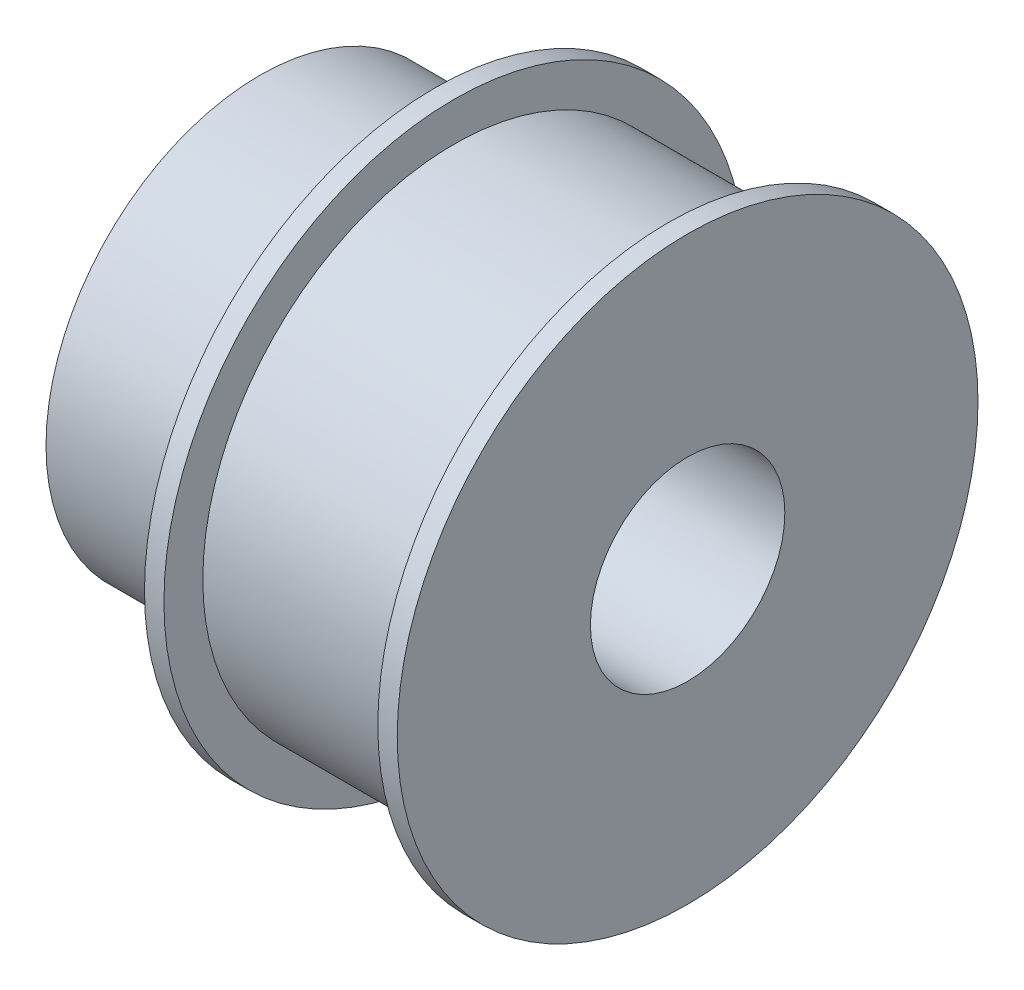
ISO-10303-21;
HEADER;
FILE_DESCRIPTION(('STEP AP214'),'2;1');
FILE_NAME('part.step','',(''),(''),'','','');
FILE_SCHEMA(('AUTOMOTIVE_DESIGN { 1 0 10303 214 1 1 1 1 }'));
ENDSEC;
DATA;
#1=APPLICATION_CONTEXT('core data for automotive mechanical design processes');
#2=APPLICATION_PROTOCOL_DEFINITION('international standard','automotive_design',2000,#1);
#3=PRODUCT_CONTEXT('',#1,'mechanical');
#4=PRODUCT('Part','Part','',(#3));
#5=PRODUCT_RELATED_PRODUCT_CATEGORY('part','',(#4));
#6=PRODUCT_DEFINITION_FORMATION('','',#4);
#7=PRODUCT_DEFINITION_CONTEXT('part definition',#1,'design');
#8=PRODUCT_DEFINITION('design','',#6,#7);
#9=PRODUCT_DEFINITION_SHAPE('','',#8);
#10=(LENGTH_UNIT() NAMED_UNIT(*) SI_UNIT(.MILLI.,.METRE.));
#11=(NAMED_UNIT(*) PLANE_ANGLE_UNIT() SI_UNIT($,.RADIAN.));
#12=(NAMED_UNIT(*) SI_UNIT($,.STERADIAN.) SOLID_ANGLE_UNIT());
#13=UNCERTAINTY_MEASURE_WITH_UNIT(LENGTH_MEASURE(1.E-05),#10,'distance_accuracy_value','');
#14=(GEOMETRIC_REPRESENTATION_CONTEXT(3) GLOBAL_UNCERTAINTY_ASSIGNED_CONTEXT((#13)) GLOBAL_UNIT_ASSIGNED_CONTEXT((#10,
#11,#12)) REPRESENTATION_CONTEXT('',''));
#15=CARTESIAN_POINT('',(0.,0.,0.));
#16=DIRECTION('',(0.,0.,1.));
#17=DIRECTION('',(1.,0.,0.));
#18=AXIS2_PLACEMENT_3D('',#15,#16,#17);
#19=CARTESIAN_POINT('',(11.,0.,0.));
#20=DIRECTION('',(-1.,0.,0.));
#21=DIRECTION('',(0.,0.,1.));
#22=AXIS2_PLACEMENT_3D('',#19,#20,#21);
#23=CYLINDRICAL_SURFACE('',#22,12.935);
#24=CARTESIAN_POINT('',(11.,0.,0.));
#25=DIRECTION('',(1.,0.,0.));
#26=DIRECTION('',(0.,0.,-1.));
#27=AXIS2_PLACEMENT_3D('',#24,#25,#26);
#28=CIRCLE('',#27,12.935);
#29=CARTESIAN_POINT('',(11.,0.,-12.935));
#30=VERTEX_POINT('',#29);
#31=EDGE_CURVE('E42',#30,#30,#28,.T.);
#32=ORIENTED_EDGE('',*,*,#31,.F.);
#33=EDGE_LOOP('',(#32));
#34=FACE_BOUND('',#33,.T.);
#35=CARTESIAN_POINT('',(0.,0.,0.));
#36=DIRECTION('',(1.,0.,0.));
#37=DIRECTION('',(0.,0.,-1.));
#38=AXIS2_PLACEMENT_3D('',#35,#36,#37);
#39=CIRCLE('',#38,12.935);
#40=CARTESIAN_POINT('',(0.,0.,-12.935));
#41=VERTEX_POINT('',#40);
#42=EDGE_CURVE('E38',#41,#41,#39,.T.);
#43=ORIENTED_EDGE('',*,*,#42,.T.);
#44=EDGE_LOOP('',(#43));
#45=FACE_BOUND('',#44,.T.);
#46=ADVANCED_FACE('F35',(#34,#45),#23,.T.);
#47=CARTESIAN_POINT('',(12.,0.,0.));
#48=DIRECTION('',(-1.,0.,0.));
#49=DIRECTION('',(0.,0.,1.));
#50=AXIS2_PLACEMENT_3D('',#47,#48,#49);
#51=CYLINDRICAL_SURFACE('',#50,14.935);
#52=CARTESIAN_POINT('',(12.,0.,0.));
#53=DIRECTION('',(1.,0.,0.));
#54=DIRECTION('',(0.,0.,-1.));
#55=AXIS2_PLACEMENT_3D('',#52,#53,#54);
#56=CIRCLE('',#55,14.935);
#57=CARTESIAN_POINT('',(12.,0.,-14.935));
#58=VERTEX_POINT('',#57);
#59=EDGE_CURVE('E47',#58,#58,#56,.T.);
#60=ORIENTED_EDGE('',*,*,#59,.F.);
#61=EDGE_LOOP('',(#60));
#62=FACE_BOUND('',#61,.T.);
#63=CARTESIAN_POINT('',(11.,0.,0.));
#64=DIRECTION('',(1.,0.,0.));
#65=DIRECTION('',(0.,0.,-1.));
#66=AXIS2_PLACEMENT_3D('',#63,#64,#65);
#67=CIRCLE('',#66,14.935);
#68=CARTESIAN_POINT('',(11.,0.,-14.935));
#69=VERTEX_POINT('',#68);
#70=EDGE_CURVE('E63',#69,#69,#67,.T.);
#71=ORIENTED_EDGE('',*,*,#70,.T.);
#72=EDGE_LOOP('',(#71));
#73=FACE_BOUND('',#72,.T.);
#74=ADVANCED_FACE('F96',(#62,#73),#51,.T.);
#75=CARTESIAN_POINT('',(12.,0.,0.));
#76=DIRECTION('',(1.,0.,0.));
#77=DIRECTION('',(0.,0.,-1.));
#78=AXIS2_PLACEMENT_3D('',#75,#76,#77);
#79=PLANE('',#78);
#80=CARTESIAN_POINT('',(12.,0.,0.));
#81=DIRECTION('',(1.,0.,0.));
#82=DIRECTION('',(0.,0.,-1.));
#83=AXIS2_PLACEMENT_3D('',#80,#81,#82);
#84=CIRCLE('',#83,5.);
#85=CARTESIAN_POINT('',(12.,0.,-5.));
#86=VERTEX_POINT('',#85);
#87=EDGE_CURVE('E50',#86,#86,#84,.T.);
#88=ORIENTED_EDGE('',*,*,#87,.F.);
#89=EDGE_LOOP('',(#88));
#90=FACE_BOUND('',#89,.T.);
#91=ORIENTED_EDGE('',*,*,#59,.T.);
#92=EDGE_LOOP('',(#91));
#93=FACE_BOUND('',#92,.T.);
#94=ADVANCED_FACE('F90',(#90,#93),#79,.T.);
#95=CARTESIAN_POINT('',(11.,0.,0.));
#96=DIRECTION('',(1.,0.,0.));
#97=DIRECTION('',(0.,0.,-1.));
#98=AXIS2_PLACEMENT_3D('',#95,#96,#97);
#99=PLANE('',#98);
#100=ORIENTED_EDGE('',*,*,#31,.T.);
#101=EDGE_LOOP('',(#100));
#102=FACE_BOUND('',#101,.T.);
#103=ORIENTED_EDGE('',*,*,#70,.F.);
#104=EDGE_LOOP('',(#103));
#105=FACE_BOUND('',#104,.T.);
#106=ADVANCED_FACE('F81',(#102,#105),#99,.F.);
#107=CARTESIAN_POINT('',(-1.,0.,0.));
#108=DIRECTION('',(1.,0.,0.));
#109=DIRECTION('',(0.,0.,-1.));
#110=AXIS2_PLACEMENT_3D('',#107,#108,#109);
#111=CYLINDRICAL_SURFACE('',#110,14.935);
#112=CARTESIAN_POINT('',(-1.,0.,0.));
#113=DIRECTION('',(-1.,0.,0.));
#114=DIRECTION('',(0.,0.,1.));
#115=AXIS2_PLACEMENT_3D('',#112,#113,#114);
#116=CIRCLE('',#115,14.935);
#117=CARTESIAN_POINT('',(-1.,0.,14.935));
#118=VERTEX_POINT('',#117);
#119=EDGE_CURVE('E56',#118,#118,#116,.T.);
#120=ORIENTED_EDGE('',*,*,#119,.F.);
#121=EDGE_LOOP('',(#120));
#122=FACE_BOUND('',#121,.T.);
#123=CARTESIAN_POINT('',(0.,0.,0.));
#124=DIRECTION('',(-1.,0.,0.));
#125=DIRECTION('',(0.,0.,1.));
#126=AXIS2_PLACEMENT_3D('',#123,#124,#125);
#127=CIRCLE('',#126,14.935);
#128=CARTESIAN_POINT('',(0.,0.,14.935));
#129=VERTEX_POINT('',#128);
#130=EDGE_CURVE('E55',#129,#129,#127,.T.);
#131=ORIENTED_EDGE('',*,*,#130,.T.);
#132=EDGE_LOOP('',(#131));
#133=FACE_BOUND('',#132,.T.);
#134=ADVANCED_FACE('F79',(#122,#133),#111,.T.);
#135=CARTESIAN_POINT('',(-1.,0.,0.));
#136=DIRECTION('',(-1.,0.,0.));
#137=DIRECTION('',(0.,0.,1.));
#138=AXIS2_PLACEMENT_3D('',#135,#136,#137);
#139=PLANE('',#138);
#140=CARTESIAN_POINT('',(-1.,0.,0.));
#141=DIRECTION('',(-1.,0.,0.));
#142=DIRECTION('',(0.,0.,1.));
#143=AXIS2_PLACEMENT_3D('',#140,#141,#142);
#144=CIRCLE('',#143,11.);
#145=CARTESIAN_POINT('',(-0.999999999999994,0.,-11.));
#146=VERTEX_POINT('',#145);
#147=EDGE_CURVE('E11',#146,#146,#144,.T.);
#148=ORIENTED_EDGE('',*,*,#147,.F.);
#149=EDGE_LOOP('',(#148));
#150=FACE_BOUND('',#149,.T.);
#151=ORIENTED_EDGE('',*,*,#119,.T.);
#152=EDGE_LOOP('',(#151));
#153=FACE_BOUND('',#152,.T.);
#154=ADVANCED_FACE('F75',(#150,#153),#139,.T.);
#155=CARTESIAN_POINT('',(0.,0.,0.));
#156=DIRECTION('',(-1.,0.,0.));
#157=DIRECTION('',(0.,0.,1.));
#158=AXIS2_PLACEMENT_3D('',#155,#156,#157);
#159=PLANE('',#158);
#160=ORIENTED_EDGE('',*,*,#42,.F.);
#161=EDGE_LOOP('',(#160));
#162=FACE_BOUND('',#161,.T.);
#163=ORIENTED_EDGE('',*,*,#130,.F.);
#164=EDGE_LOOP('',(#163));
#165=FACE_BOUND('',#164,.T.);
#166=ADVANCED_FACE('F71',(#162,#165),#159,.F.);
#167=CARTESIAN_POINT('',(-63.1126983722081,0.,0.));
#168=DIRECTION('',(1.,0.,0.));
#169=DIRECTION('',(0.,0.,-1.));
#170=AXIS2_PLACEMENT_3D('',#167,#168,#169);
#171=CYLINDRICAL_SURFACE('',#170,11.);
#172=CARTESIAN_POINT('',(-9.99999999999999,0.,0.));
#173=DIRECTION('',(1.,0.,0.));
#174=DIRECTION('',(0.,0.,-1.));
#175=AXIS2_PLACEMENT_3D('',#172,#173,#174);
#176=CIRCLE('',#175,11.);
#177=CARTESIAN_POINT('',(-10.,0.,-11.));
#178=VERTEX_POINT('',#177);
#179=EDGE_CURVE('E52',#178,#178,#176,.T.);
#180=CARTESIAN_POINT('',(-10.,0.,-11.));
#181=CARTESIAN_POINT('',(-9.90625,0.,-11.));
#182=CARTESIAN_POINT('',(-9.8125,0.,-11.));
#183=CARTESIAN_POINT('',(-9.625,0.,-11.));
#184=CARTESIAN_POINT('',(-9.53125,0.,-11.));
#185=CARTESIAN_POINT('',(-9.34375,0.,-11.));
#186=CARTESIAN_POINT('',(-9.25,0.,-11.));
#187=CARTESIAN_POINT('',(-9.0625,0.,-11.));
#188=CARTESIAN_POINT('',(-8.96875,0.,-11.));
#189=CARTESIAN_POINT('',(-8.78125,0.,-11.));
#190=CARTESIAN_POINT('',(-8.6875,0.,-11.));
#191=CARTESIAN_POINT('',(-8.5,0.,-11.));
#192=CARTESIAN_POINT('',(-8.40625,0.,-11.));
#193=CARTESIAN_POINT('',(-8.21875,0.,-11.));
#194=CARTESIAN_POINT('',(-8.125,0.,-11.));
#195=CARTESIAN_POINT('',(-7.9375,0.,-11.));
#196=CARTESIAN_POINT('',(-7.84375,0.,-11.));
#197=CARTESIAN_POINT('',(-7.65625,0.,-11.));
#198=CARTESIAN_POINT('',(-7.5625,0.,-11.));
#199=CARTESIAN_POINT('',(-7.375,0.,-11.));
#200=CARTESIAN_POINT('',(-7.28125,0.,-11.));
#201=CARTESIAN_POINT('',(-7.09375,0.,-11.));
#202=CARTESIAN_POINT('',(-7.,0.,-11.));
#203=CARTESIAN_POINT('',(-6.8125,0.,-11.));
#204=CARTESIAN_POINT('',(-6.71875,0.,-11.));
#205=CARTESIAN_POINT('',(-6.53125,0.,-11.));
#206=CARTESIAN_POINT('',(-6.4375,0.,-11.));
#207=CARTESIAN_POINT('',(-6.25,0.,-11.));
#208=CARTESIAN_POINT('',(-6.15625,0.,-11.));
#209=CARTESIAN_POINT('',(-5.96875,0.,-11.));
#210=CARTESIAN_POINT('',(-5.875,0.,-11.));
#211=CARTESIAN_POINT('',(-5.6875,0.,-11.));
#212=CARTESIAN_POINT('',(-5.59375,0.,-11.));
#213=CARTESIAN_POINT('',(-5.40625,0.,-11.));
#214=CARTESIAN_POINT('',(-5.3125,0.,-11.));
#215=CARTESIAN_POINT('',(-5.125,0.,-11.));
#216=CARTESIAN_POINT('',(-5.03125,0.,-11.));
#217=CARTESIAN_POINT('',(-4.84375,0.,-11.));
#218=CARTESIAN_POINT('',(-4.74999999999999,0.,-11.));
#219=CARTESIAN_POINT('',(-4.56249999999999,0.,-11.));
#220=CARTESIAN_POINT('',(-4.46875,0.,-11.));
#221=CARTESIAN_POINT('',(-4.28125,0.,-11.));
#222=CARTESIAN_POINT('',(-4.1875,0.,-11.));
#223=CARTESIAN_POINT('',(-4.,0.,-11.));
#224=CARTESIAN_POINT('',(-3.90625,0.,-11.));
#225=CARTESIAN_POINT('',(-3.71875,0.,-11.));
#226=CARTESIAN_POINT('',(-3.62499999999999,0.,-11.));
#227=CARTESIAN_POINT('',(-3.43749999999999,0.,-11.));
#228=CARTESIAN_POINT('',(-3.34374999999999,0.,-11.));
#229=CARTESIAN_POINT('',(-3.15625,0.,-11.));
#230=CARTESIAN_POINT('',(-3.0625,0.,-11.));
#231=CARTESIAN_POINT('',(-2.875,0.,-11.));
#232=CARTESIAN_POINT('',(-2.78125,0.,-11.));
#233=CARTESIAN_POINT('',(-2.59374999999999,0.,-11.));
#234=CARTESIAN_POINT('',(-2.49999999999999,0.,-11.));
#235=CARTESIAN_POINT('',(-2.31249999999999,0.,-11.));
#236=CARTESIAN_POINT('',(-2.21874999999999,0.,-11.));
#237=CARTESIAN_POINT('',(-2.03125,0.,-11.));
#238=CARTESIAN_POINT('',(-1.9375,0.,-11.));
#239=CARTESIAN_POINT('',(-1.75,0.,-11.));
#240=CARTESIAN_POINT('',(-1.65625,0.,-11.));
#241=CARTESIAN_POINT('',(-1.46874999999999,0.,-11.));
#242=CARTESIAN_POINT('',(-1.37499999999999,0.,-11.));
#243=CARTESIAN_POINT('',(-1.18749999999999,0.,-11.));
#244=CARTESIAN_POINT('',(-1.09374999999999,0.,-11.));
#245=CARTESIAN_POINT('',(-0.999999999999994,0.,-11.));
#246=B_SPLINE_CURVE_WITH_KNOTS('',3,(#180,#181,#182,#183,#184,#185,#186,#187,#188,#189,#190,
#191,#192,#193,#194,#195,#196,#197,#198,#199,#200,#201,#202,#203,#204,#205,#206,#207,#208,#209,
#210,#211,#212,#213,#214,#215,#216,#217,#218,#219,#220,#221,#222,#223,#224,#225,#226,#227,#228,
#229,#230,#231,#232,#233,#234,#235,#236,#237,#238,#239,#240,#241,#242,#243,#244,#245),
.UNSPECIFIED.,.F.,.F.,(4,2,2,2,2,2,2,2,2,2,2,2,2,2,2,2,2,2,2,2,2,2,2,2,2,2,2,2,2,2,2,2,4),(0.,
0.281249999999997,0.5625,0.843750000000004,1.125,1.40625,1.6875,1.96875000000001,2.25,2.53125,
2.8125,3.09375000000001,3.375,3.65625,3.9375,4.21875000000001,4.5,4.78125,5.0625,
5.34375000000001,5.62500000000001,5.90625,6.18750000000001,6.46875000000001,6.75000000000001,
7.03125,7.31250000000001,7.59375000000001,7.87500000000001,8.15625,8.43750000000001,
8.71875000000001,9.00000000000001),.UNSPECIFIED.);
#247=EDGE_CURVE('BSEAM74',#178,#146,#246,.T.);
#248=ORIENTED_EDGE('',*,*,#179,.T.);
#249=ORIENTED_EDGE('',*,*,#147,.T.);
#250=ORIENTED_EDGE('',*,*,#247,.T.);
#251=ORIENTED_EDGE('',*,*,#247,.F.);
#252=EDGE_LOOP('',(#248,#250,#249,#251));
#253=FACE_BOUND('',#252,.T.);
#254=ADVANCED_FACE('F74',(#253),#171,.T.);
#255=CARTESIAN_POINT('',(-10.,0.,0.));
#256=DIRECTION('',(1.,0.,0.));
#257=DIRECTION('',(0.,0.,-1.));
#258=AXIS2_PLACEMENT_3D('',#255,#256,#257);
#259=PLANE('',#258);
#260=CARTESIAN_POINT('',(-10.,0.,0.));
#261=DIRECTION('',(-1.,0.,0.));
#262=DIRECTION('',(0.,0.,1.));
#263=AXIS2_PLACEMENT_3D('',#260,#261,#262);
#264=CIRCLE('',#263,5.);
#265=CARTESIAN_POINT('',(-10.,0.,5.));
#266=VERTEX_POINT('',#265);
#267=EDGE_CURVE('E115',#266,#266,#264,.T.);
#268=ORIENTED_EDGE('',*,*,#267,.F.);
#269=EDGE_LOOP('',(#268));
#270=FACE_BOUND('',#269,.T.);
#271=ORIENTED_EDGE('',*,*,#179,.F.);
#272=EDGE_LOOP('',(#271));
#273=FACE_BOUND('',#272,.T.);
#274=ADVANCED_FACE('F121',(#270,#273),#259,.F.);
#275=CARTESIAN_POINT('',(20.,0.,0.));
#276=DIRECTION('',(-1.,0.,0.));
#277=DIRECTION('',(0.,0.,1.));
#278=AXIS2_PLACEMENT_3D('',#275,#276,#277);
#279=CYLINDRICAL_SURFACE('',#278,5.);
#280=ORIENTED_EDGE('',*,*,#87,.T.);
#281=EDGE_LOOP('',(#280));
#282=FACE_BOUND('',#281,.T.);
#283=ORIENTED_EDGE('',*,*,#267,.T.);
#284=EDGE_LOOP('',(#283));
#285=FACE_BOUND('',#284,.T.);
#286=ADVANCED_FACE('F119',(#282,#285),#279,.F.);
#287=CLOSED_SHELL('',(#46,#74,#94,#106,#134,#154,#166,#254,#274,#286));
#288=MANIFOLD_SOLID_BREP('B2',#287);
#289=ADVANCED_BREP_SHAPE_REPRESENTATION('',(#18,#288),#14);
#290=SHAPE_DEFINITION_REPRESENTATION(#9,#289);
ENDSEC;
END-ISO-10303-21;
